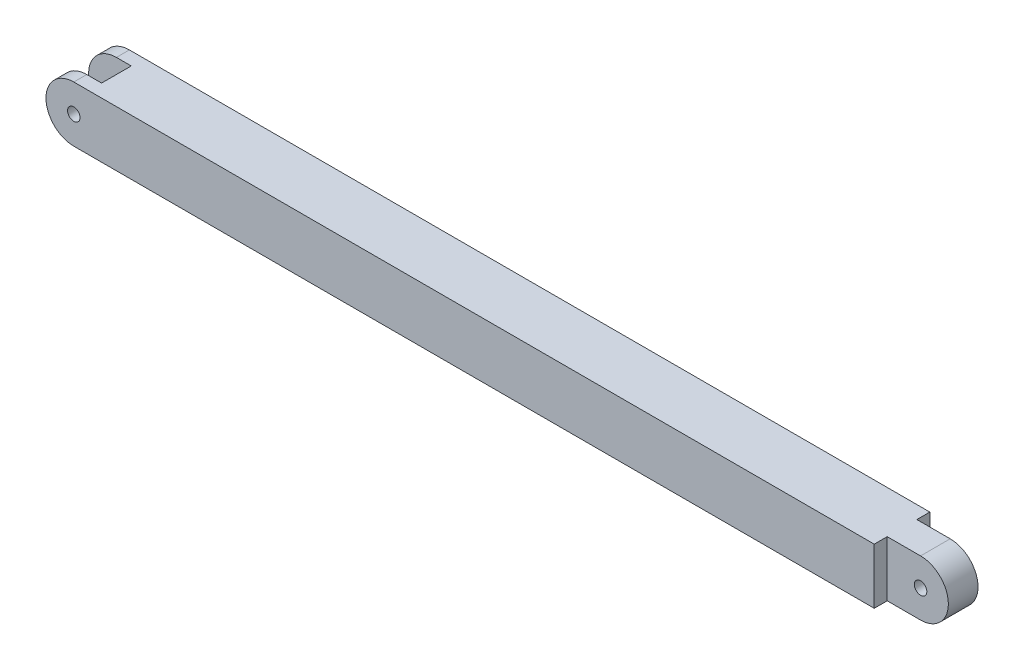
ISO-10303-21;
HEADER;
FILE_DESCRIPTION(('STEP AP214'),'2;1');
FILE_NAME('part.step','',(''),(''),'','','');
FILE_SCHEMA(('AUTOMOTIVE_DESIGN { 1 0 10303 214 1 1 1 1 }'));
ENDSEC;
DATA;
#1=APPLICATION_CONTEXT('core data for automotive mechanical design processes');
#2=APPLICATION_PROTOCOL_DEFINITION('international standard','automotive_design',2000,#1);
#3=PRODUCT_CONTEXT('',#1,'mechanical');
#4=PRODUCT('Part','Part','',(#3));
#5=PRODUCT_RELATED_PRODUCT_CATEGORY('part','',(#4));
#6=PRODUCT_DEFINITION_FORMATION('','',#4);
#7=PRODUCT_DEFINITION_CONTEXT('part definition',#1,'design');
#8=PRODUCT_DEFINITION('design','',#6,#7);
#9=PRODUCT_DEFINITION_SHAPE('','',#8);
#10=(LENGTH_UNIT() NAMED_UNIT(*) SI_UNIT(.MILLI.,.METRE.));
#11=(NAMED_UNIT(*) PLANE_ANGLE_UNIT() SI_UNIT($,.RADIAN.));
#12=(NAMED_UNIT(*) SI_UNIT($,.STERADIAN.) SOLID_ANGLE_UNIT());
#13=UNCERTAINTY_MEASURE_WITH_UNIT(LENGTH_MEASURE(1.E-05),#10,'distance_accuracy_value','');
#14=(GEOMETRIC_REPRESENTATION_CONTEXT(3) GLOBAL_UNCERTAINTY_ASSIGNED_CONTEXT((#13)) GLOBAL_UNIT_ASSIGNED_CONTEXT((#10,
#11,#12)) REPRESENTATION_CONTEXT('',''));
#15=CARTESIAN_POINT('',(0.,0.,0.));
#16=DIRECTION('',(0.,0.,1.));
#17=DIRECTION('',(1.,0.,0.));
#18=AXIS2_PLACEMENT_3D('',#15,#16,#17);
#19=CARTESIAN_POINT('',(-225.,0.,15.));
#20=DIRECTION('',(0.,0.,-1.));
#21=DIRECTION('',(-1.,0.,0.));
#22=AXIS2_PLACEMENT_3D('',#19,#20,#21);
#23=CYLINDRICAL_SURFACE('',#22,15.);
#24=DIRECTION('',(0.,0.,-1.));
#25=VECTOR('',#24,1.);
#26=CARTESIAN_POINT('',(-225.,-15.,15.));
#27=LINE('',#26,#25);
#28=CARTESIAN_POINT('',(-225.,-15.0000000000001,-8.));
#29=VERTEX_POINT('',#28);
#30=CARTESIAN_POINT('',(-225.,-15.,-15.));
#31=VERTEX_POINT('',#30);
#32=EDGE_CURVE('E223',#29,#31,#27,.T.);
#33=ORIENTED_EDGE('',*,*,#32,.F.);
#34=CARTESIAN_POINT('',(-225.,0.,-8.));
#35=DIRECTION('',(0.,0.,-1.));
#36=DIRECTION('',(-1.,0.,0.));
#37=AXIS2_PLACEMENT_3D('',#34,#35,#36);
#38=CIRCLE('',#37,15.);
#39=CARTESIAN_POINT('',(-225.,15.,-8.));
#40=VERTEX_POINT('',#39);
#41=EDGE_CURVE('E179',#29,#40,#38,.T.);
#42=ORIENTED_EDGE('',*,*,#41,.T.);
#43=DIRECTION('',(0.,0.,-1.));
#44=VECTOR('',#43,1.);
#45=CARTESIAN_POINT('',(-225.,15.,15.));
#46=LINE('',#45,#44);
#47=CARTESIAN_POINT('',(-225.,15.,-15.));
#48=VERTEX_POINT('',#47);
#49=EDGE_CURVE('E206',#40,#48,#46,.T.);
#50=ORIENTED_EDGE('',*,*,#49,.T.);
#51=CARTESIAN_POINT('',(-225.,0.,-15.));
#52=DIRECTION('',(0.,0.,1.));
#53=DIRECTION('',(1.,0.,0.));
#54=AXIS2_PLACEMENT_3D('',#51,#52,#53);
#55=CIRCLE('',#54,15.);
#56=EDGE_CURVE('E196',#48,#31,#55,.T.);
#57=ORIENTED_EDGE('',*,*,#56,.T.);
#58=EDGE_LOOP('',(#33,#42,#50,#57));
#59=FACE_BOUND('',#58,.T.);
#60=ADVANCED_FACE('F33',(#59),#23,.T.);
#61=CARTESIAN_POINT('',(-225.,0.,15.));
#62=DIRECTION('',(0.,0.,1.));
#63=DIRECTION('',(1.,0.,0.));
#64=AXIS2_PLACEMENT_3D('',#61,#62,#63);
#65=CYLINDRICAL_SURFACE('',#64,3.3782);
#66=CARTESIAN_POINT('',(-225.,0.,-8.));
#67=DIRECTION('',(0.,0.,-1.));
#68=DIRECTION('',(-1.,0.,0.));
#69=AXIS2_PLACEMENT_3D('',#66,#67,#68);
#70=CIRCLE('',#69,3.3782);
#71=CARTESIAN_POINT('',(-228.3782,0.,-8.));
#72=VERTEX_POINT('',#71);
#73=EDGE_CURVE('E178',#72,#72,#70,.F.);
#74=ORIENTED_EDGE('',*,*,#73,.T.);
#75=EDGE_LOOP('',(#74));
#76=FACE_BOUND('',#75,.T.);
#77=CARTESIAN_POINT('',(-225.,0.,-15.));
#78=DIRECTION('',(0.,0.,1.));
#79=DIRECTION('',(1.,0.,0.));
#80=AXIS2_PLACEMENT_3D('',#77,#78,#79);
#81=CIRCLE('',#80,3.3782);
#82=CARTESIAN_POINT('',(-221.6218,0.,-15.));
#83=VERTEX_POINT('',#82);
#84=EDGE_CURVE('E193',#83,#83,#81,.T.);
#85=ORIENTED_EDGE('',*,*,#84,.F.);
#86=EDGE_LOOP('',(#85));
#87=FACE_BOUND('',#86,.T.);
#88=ADVANCED_FACE('F277',(#76,#87),#65,.F.);
#89=CARTESIAN_POINT('',(-225.,15.,15.));
#90=VERTEX_POINT('',#89);
#91=CARTESIAN_POINT('',(-225.,15.,8.));
#92=VERTEX_POINT('',#91);
#93=EDGE_CURVE('E214',#90,#92,#46,.T.);
#94=ORIENTED_EDGE('',*,*,#93,.T.);
#95=CARTESIAN_POINT('',(-225.,0.,8.));
#96=DIRECTION('',(0.,0.,1.));
#97=DIRECTION('',(1.,0.,0.));
#98=AXIS2_PLACEMENT_3D('',#95,#96,#97);
#99=CIRCLE('',#98,15.);
#100=CARTESIAN_POINT('',(-225.,-15.0000000000001,8.));
#101=VERTEX_POINT('',#100);
#102=EDGE_CURVE('E48',#92,#101,#99,.T.);
#103=ORIENTED_EDGE('',*,*,#102,.T.);
#104=CARTESIAN_POINT('',(-225.,-15.,15.));
#105=VERTEX_POINT('',#104);
#106=EDGE_CURVE('E142',#105,#101,#27,.T.);
#107=ORIENTED_EDGE('',*,*,#106,.F.);
#108=CARTESIAN_POINT('',(-225.,0.,15.));
#109=DIRECTION('',(0.,0.,1.));
#110=DIRECTION('',(1.,0.,0.));
#111=AXIS2_PLACEMENT_3D('',#108,#109,#110);
#112=CIRCLE('',#111,15.);
#113=EDGE_CURVE('E197',#90,#105,#112,.T.);
#114=ORIENTED_EDGE('',*,*,#113,.F.);
#115=EDGE_LOOP('',(#94,#103,#107,#114));
#116=FACE_BOUND('',#115,.T.);
#117=ADVANCED_FACE('F35',(#116),#23,.T.);
#118=CARTESIAN_POINT('',(-225.,-15.,15.));
#119=DIRECTION('',(0.,1.,0.));
#120=DIRECTION('',(-1.,0.,0.));
#121=AXIS2_PLACEMENT_3D('',#118,#119,#120);
#122=PLANE('',#121);
#123=DIRECTION('',(0.,0.,-1.));
#124=VECTOR('',#123,1.);
#125=CARTESIAN_POINT('',(-217.,-15.0000000000001,-8.));
#126=LINE('',#125,#124);
#127=CARTESIAN_POINT('',(-217.,-15.0000000000001,8.));
#128=VERTEX_POINT('',#127);
#129=CARTESIAN_POINT('',(-217.,-15.0000000000001,-8.));
#130=VERTEX_POINT('',#129);
#131=EDGE_CURVE('E133',#128,#130,#126,.T.);
#132=ORIENTED_EDGE('',*,*,#131,.T.);
#133=DIRECTION('',(-1.,0.,0.));
#134=VECTOR('',#133,1.);
#135=CARTESIAN_POINT('',(-257.,-15.0000000000001,-8.));
#136=LINE('',#135,#134);
#137=EDGE_CURVE('E130',#130,#29,#136,.T.);
#138=ORIENTED_EDGE('',*,*,#137,.T.);
#139=ORIENTED_EDGE('',*,*,#32,.T.);
#140=DIRECTION('',(1.,0.,0.));
#141=VECTOR('',#140,1.);
#142=CARTESIAN_POINT('',(-225.,-15.,-15.));
#143=LINE('',#142,#141);
#144=CARTESIAN_POINT('',(207.,-14.9999999999999,-15.));
#145=VERTEX_POINT('',#144);
#146=EDGE_CURVE('E209',#31,#145,#143,.T.);
#147=ORIENTED_EDGE('',*,*,#146,.T.);
#148=DIRECTION('',(0.,0.,1.));
#149=VECTOR('',#148,1.);
#150=CARTESIAN_POINT('',(207.,-15.,-28.9161112376698));
#151=LINE('',#150,#149);
#152=CARTESIAN_POINT('',(207.,-15.,-8.));
#153=VERTEX_POINT('',#152);
#154=EDGE_CURVE('E154',#145,#153,#151,.T.);
#155=ORIENTED_EDGE('',*,*,#154,.T.);
#156=DIRECTION('',(1.,0.,0.));
#157=VECTOR('',#156,1.);
#158=CARTESIAN_POINT('',(207.,-15.,-8.));
#159=LINE('',#158,#157);
#160=CARTESIAN_POINT('',(225.,-15.,-8.));
#161=VERTEX_POINT('',#160);
#162=EDGE_CURVE('E157',#153,#161,#159,.T.);
#163=ORIENTED_EDGE('',*,*,#162,.T.);
#164=DIRECTION('',(0.,0.,-1.));
#165=VECTOR('',#164,1.);
#166=CARTESIAN_POINT('',(225.,-14.9999999999999,15.));
#167=LINE('',#166,#165);
#168=CARTESIAN_POINT('',(225.,-15.,8.));
#169=VERTEX_POINT('',#168);
#170=EDGE_CURVE('E220',#169,#161,#167,.T.);
#171=ORIENTED_EDGE('',*,*,#170,.F.);
#172=DIRECTION('',(-1.,0.,0.));
#173=VECTOR('',#172,1.);
#174=CARTESIAN_POINT('',(207.,-15.,8.));
#175=LINE('',#174,#173);
#176=CARTESIAN_POINT('',(207.,-15.,8.));
#177=VERTEX_POINT('',#176);
#178=EDGE_CURVE('E170',#169,#177,#175,.T.);
#179=ORIENTED_EDGE('',*,*,#178,.T.);
#180=DIRECTION('',(0.,0.,1.));
#181=VECTOR('',#180,1.);
#182=CARTESIAN_POINT('',(207.,-15.,28.9161112376696));
#183=LINE('',#182,#181);
#184=CARTESIAN_POINT('',(207.,-15.,15.));
#185=VERTEX_POINT('',#184);
#186=EDGE_CURVE('E167',#177,#185,#183,.T.);
#187=ORIENTED_EDGE('',*,*,#186,.T.);
#188=DIRECTION('',(1.,0.,0.));
#189=VECTOR('',#188,1.);
#190=CARTESIAN_POINT('',(-225.,-15.,15.));
#191=LINE('',#190,#189);
#192=EDGE_CURVE('E200',#105,#185,#191,.T.);
#193=ORIENTED_EDGE('',*,*,#192,.F.);
#194=ORIENTED_EDGE('',*,*,#106,.T.);
#195=DIRECTION('',(1.,0.,0.));
#196=VECTOR('',#195,1.);
#197=CARTESIAN_POINT('',(-257.,-15.0000000000001,8.));
#198=LINE('',#197,#196);
#199=EDGE_CURVE('E124',#101,#128,#198,.T.);
#200=ORIENTED_EDGE('',*,*,#199,.T.);
#201=EDGE_LOOP('',(#132,#138,#139,#147,#155,#163,#171,#179,#187,#193,#194,#200));
#202=FACE_BOUND('',#201,.T.);
#203=ADVANCED_FACE('F140',(#202),#122,.F.);
#204=CARTESIAN_POINT('',(225.,0.,15.));
#205=DIRECTION('',(0.,0.,-1.));
#206=DIRECTION('',(-1.,0.,0.));
#207=AXIS2_PLACEMENT_3D('',#204,#205,#206);
#208=CYLINDRICAL_SURFACE('',#207,15.);
#209=ORIENTED_EDGE('',*,*,#170,.T.);
#210=CARTESIAN_POINT('',(225.,0.,-8.));
#211=DIRECTION('',(0.,0.,1.));
#212=DIRECTION('',(1.,0.,0.));
#213=AXIS2_PLACEMENT_3D('',#210,#211,#212);
#214=CIRCLE('',#213,15.);
#215=CARTESIAN_POINT('',(225.,15.0000000000001,-8.));
#216=VERTEX_POINT('',#215);
#217=EDGE_CURVE('E187',#161,#216,#214,.T.);
#218=ORIENTED_EDGE('',*,*,#217,.T.);
#219=DIRECTION('',(0.,0.,-1.));
#220=VECTOR('',#219,1.);
#221=CARTESIAN_POINT('',(225.,15.0000000000001,15.));
#222=LINE('',#221,#220);
#223=CARTESIAN_POINT('',(225.,15.0000000000001,8.));
#224=VERTEX_POINT('',#223);
#225=EDGE_CURVE('E217',#224,#216,#222,.T.);
#226=ORIENTED_EDGE('',*,*,#225,.F.);
#227=CARTESIAN_POINT('',(225.,0.,8.));
#228=DIRECTION('',(0.,0.,-1.));
#229=DIRECTION('',(-1.,0.,0.));
#230=AXIS2_PLACEMENT_3D('',#227,#228,#229);
#231=CIRCLE('',#230,15.);
#232=EDGE_CURVE('E183',#224,#169,#231,.T.);
#233=ORIENTED_EDGE('',*,*,#232,.T.);
#234=EDGE_LOOP('',(#209,#218,#226,#233));
#235=FACE_BOUND('',#234,.T.);
#236=ADVANCED_FACE('F253',(#235),#208,.T.);
#237=CARTESIAN_POINT('',(-225.,15.,15.));
#238=DIRECTION('',(0.,-1.,0.));
#239=DIRECTION('',(1.,0.,0.));
#240=AXIS2_PLACEMENT_3D('',#237,#238,#239);
#241=PLANE('',#240);
#242=ORIENTED_EDGE('',*,*,#49,.F.);
#243=DIRECTION('',(-1.,0.,0.));
#244=VECTOR('',#243,1.);
#245=CARTESIAN_POINT('',(-257.,15.,-8.));
#246=LINE('',#245,#244);
#247=CARTESIAN_POINT('',(-217.,15.,-8.));
#248=VERTEX_POINT('',#247);
#249=EDGE_CURVE('E143',#248,#40,#246,.T.);
#250=ORIENTED_EDGE('',*,*,#249,.F.);
#251=DIRECTION('',(0.,0.,-1.));
#252=VECTOR('',#251,1.);
#253=CARTESIAN_POINT('',(-217.,15.,-8.));
#254=LINE('',#253,#252);
#255=CARTESIAN_POINT('',(-217.,15.,8.));
#256=VERTEX_POINT('',#255);
#257=EDGE_CURVE('E145',#256,#248,#254,.T.);
#258=ORIENTED_EDGE('',*,*,#257,.F.);
#259=DIRECTION('',(1.,0.,0.));
#260=VECTOR('',#259,1.);
#261=CARTESIAN_POINT('',(-257.,15.,8.));
#262=LINE('',#261,#260);
#263=EDGE_CURVE('E125',#92,#256,#262,.T.);
#264=ORIENTED_EDGE('',*,*,#263,.F.);
#265=ORIENTED_EDGE('',*,*,#93,.F.);
#266=DIRECTION('',(-1.,0.,0.));
#267=VECTOR('',#266,1.);
#268=CARTESIAN_POINT('',(-225.,15.,15.));
#269=LINE('',#268,#267);
#270=CARTESIAN_POINT('',(207.,15.0000000000001,15.));
#271=VERTEX_POINT('',#270);
#272=EDGE_CURVE('E204',#271,#90,#269,.T.);
#273=ORIENTED_EDGE('',*,*,#272,.F.);
#274=DIRECTION('',(0.,0.,1.));
#275=VECTOR('',#274,1.);
#276=CARTESIAN_POINT('',(207.,15.0000000000001,28.9161112376696));
#277=LINE('',#276,#275);
#278=CARTESIAN_POINT('',(207.,15.0000000000001,8.));
#279=VERTEX_POINT('',#278);
#280=EDGE_CURVE('E55',#279,#271,#277,.T.);
#281=ORIENTED_EDGE('',*,*,#280,.F.);
#282=DIRECTION('',(-1.,0.,0.));
#283=VECTOR('',#282,1.);
#284=CARTESIAN_POINT('',(207.,15.0000000000001,8.));
#285=LINE('',#284,#283);
#286=EDGE_CURVE('E171',#224,#279,#285,.T.);
#287=ORIENTED_EDGE('',*,*,#286,.F.);
#288=ORIENTED_EDGE('',*,*,#225,.T.);
#289=DIRECTION('',(1.,0.,0.));
#290=VECTOR('',#289,1.);
#291=CARTESIAN_POINT('',(207.,15.0000000000001,-8.));
#292=LINE('',#291,#290);
#293=CARTESIAN_POINT('',(207.,15.0000000000001,-8.));
#294=VERTEX_POINT('',#293);
#295=EDGE_CURVE('E158',#294,#216,#292,.T.);
#296=ORIENTED_EDGE('',*,*,#295,.F.);
#297=DIRECTION('',(0.,0.,1.));
#298=VECTOR('',#297,1.);
#299=CARTESIAN_POINT('',(207.,15.0000000000001,-28.9161112376698));
#300=LINE('',#299,#298);
#301=CARTESIAN_POINT('',(207.,15.0000000000001,-15.));
#302=VERTEX_POINT('',#301);
#303=EDGE_CURVE('E161',#302,#294,#300,.T.);
#304=ORIENTED_EDGE('',*,*,#303,.F.);
#305=DIRECTION('',(-1.,0.,0.));
#306=VECTOR('',#305,1.);
#307=CARTESIAN_POINT('',(-225.,15.,-15.));
#308=LINE('',#307,#306);
#309=EDGE_CURVE('E201',#302,#48,#308,.T.);
#310=ORIENTED_EDGE('',*,*,#309,.T.);
#311=EDGE_LOOP('',(#242,#250,#258,#264,#265,#273,#281,#287,#288,#296,#304,#310));
#312=FACE_BOUND('',#311,.T.);
#313=ADVANCED_FACE('F245',(#312),#241,.F.);
#314=CARTESIAN_POINT('',(-225.,0.,15.));
#315=DIRECTION('',(0.,0.,1.));
#316=DIRECTION('',(1.,0.,0.));
#317=AXIS2_PLACEMENT_3D('',#314,#315,#316);
#318=PLANE('',#317);
#319=DIRECTION('',(0.,-1.,0.));
#320=VECTOR('',#319,1.);
#321=CARTESIAN_POINT('',(207.,0.,15.));
#322=LINE('',#321,#320);
#323=EDGE_CURVE('E11',#271,#185,#322,.T.);
#324=ORIENTED_EDGE('',*,*,#323,.F.);
#325=ORIENTED_EDGE('',*,*,#272,.T.);
#326=ORIENTED_EDGE('',*,*,#113,.T.);
#327=ORIENTED_EDGE('',*,*,#192,.T.);
#328=EDGE_LOOP('',(#324,#325,#326,#327));
#329=FACE_BOUND('',#328,.T.);
#330=CARTESIAN_POINT('',(-225.,0.,15.));
#331=DIRECTION('',(0.,0.,1.));
#332=DIRECTION('',(1.,0.,0.));
#333=AXIS2_PLACEMENT_3D('',#330,#331,#332);
#334=CIRCLE('',#333,3.3782);
#335=CARTESIAN_POINT('',(-221.6218,0.,15.));
#336=VERTEX_POINT('',#335);
#337=EDGE_CURVE('E190',#336,#336,#334,.T.);
#338=ORIENTED_EDGE('',*,*,#337,.F.);
#339=EDGE_LOOP('',(#338));
#340=FACE_BOUND('',#339,.T.);
#341=ADVANCED_FACE('F262',(#329,#340),#318,.T.);
#342=CARTESIAN_POINT('',(-225.,0.,-15.));
#343=DIRECTION('',(0.,0.,1.));
#344=DIRECTION('',(1.,0.,0.));
#345=AXIS2_PLACEMENT_3D('',#342,#343,#344);
#346=PLANE('',#345);
#347=ORIENTED_EDGE('',*,*,#84,.T.);
#348=EDGE_LOOP('',(#347));
#349=FACE_BOUND('',#348,.T.);
#350=ORIENTED_EDGE('',*,*,#309,.F.);
#351=DIRECTION('',(0.,-1.,0.));
#352=VECTOR('',#351,1.);
#353=CARTESIAN_POINT('',(207.,0.,-15.));
#354=LINE('',#353,#352);
#355=EDGE_CURVE('E41',#302,#145,#354,.T.);
#356=ORIENTED_EDGE('',*,*,#355,.T.);
#357=ORIENTED_EDGE('',*,*,#146,.F.);
#358=ORIENTED_EDGE('',*,*,#56,.F.);
#359=EDGE_LOOP('',(#350,#356,#357,#358));
#360=FACE_BOUND('',#359,.T.);
#361=ADVANCED_FACE('F236',(#349,#360),#346,.F.);
#362=CARTESIAN_POINT('',(-225.,0.,8.));
#363=DIRECTION('',(0.,0.,1.));
#364=DIRECTION('',(1.,0.,0.));
#365=AXIS2_PLACEMENT_3D('',#362,#363,#364);
#366=CIRCLE('',#365,3.3782);
#367=CARTESIAN_POINT('',(-221.6218,0.,8.));
#368=VERTEX_POINT('',#367);
#369=EDGE_CURVE('E152',#368,#368,#366,.F.);
#370=ORIENTED_EDGE('',*,*,#369,.T.);
#371=EDGE_LOOP('',(#370));
#372=FACE_BOUND('',#371,.T.);
#373=ORIENTED_EDGE('',*,*,#337,.T.);
#374=EDGE_LOOP('',(#373));
#375=FACE_BOUND('',#374,.T.);
#376=ADVANCED_FACE('F282',(#372,#375),#65,.F.);
#377=CARTESIAN_POINT('',(-257.,-15.0000000000001,-8.));
#378=DIRECTION('',(0.,0.,-1.));
#379=DIRECTION('',(-1.,0.,0.));
#380=AXIS2_PLACEMENT_3D('',#377,#378,#379);
#381=PLANE('',#380);
#382=ORIENTED_EDGE('',*,*,#73,.F.);
#383=EDGE_LOOP('',(#382));
#384=FACE_BOUND('',#383,.T.);
#385=ORIENTED_EDGE('',*,*,#137,.F.);
#386=DIRECTION('',(0.,1.,0.));
#387=VECTOR('',#386,1.);
#388=CARTESIAN_POINT('',(-217.,-15.0000000000001,-8.));
#389=LINE('',#388,#387);
#390=EDGE_CURVE('E129',#130,#248,#389,.T.);
#391=ORIENTED_EDGE('',*,*,#390,.T.);
#392=ORIENTED_EDGE('',*,*,#249,.T.);
#393=ORIENTED_EDGE('',*,*,#41,.F.);
#394=EDGE_LOOP('',(#385,#391,#392,#393));
#395=FACE_BOUND('',#394,.T.);
#396=ADVANCED_FACE('F304',(#384,#395),#381,.F.);
#397=CARTESIAN_POINT('',(-257.,-15.0000000000001,8.));
#398=DIRECTION('',(0.,0.,1.));
#399=DIRECTION('',(1.,0.,0.));
#400=AXIS2_PLACEMENT_3D('',#397,#398,#399);
#401=PLANE('',#400);
#402=ORIENTED_EDGE('',*,*,#369,.F.);
#403=EDGE_LOOP('',(#402));
#404=FACE_BOUND('',#403,.T.);
#405=ORIENTED_EDGE('',*,*,#263,.T.);
#406=DIRECTION('',(0.,1.,0.));
#407=VECTOR('',#406,1.);
#408=CARTESIAN_POINT('',(-217.,-15.0000000000001,8.));
#409=LINE('',#408,#407);
#410=EDGE_CURVE('E120',#128,#256,#409,.T.);
#411=ORIENTED_EDGE('',*,*,#410,.F.);
#412=ORIENTED_EDGE('',*,*,#199,.F.);
#413=ORIENTED_EDGE('',*,*,#102,.F.);
#414=EDGE_LOOP('',(#405,#411,#412,#413));
#415=FACE_BOUND('',#414,.T.);
#416=ADVANCED_FACE('F122',(#404,#415),#401,.F.);
#417=CARTESIAN_POINT('',(-217.,-15.0000000000001,-8.));
#418=DIRECTION('',(1.,0.,0.));
#419=DIRECTION('',(0.,1.,0.));
#420=AXIS2_PLACEMENT_3D('',#417,#418,#419);
#421=PLANE('',#420);
#422=ORIENTED_EDGE('',*,*,#257,.T.);
#423=ORIENTED_EDGE('',*,*,#390,.F.);
#424=ORIENTED_EDGE('',*,*,#131,.F.);
#425=ORIENTED_EDGE('',*,*,#410,.T.);
#426=EDGE_LOOP('',(#422,#423,#424,#425));
#427=FACE_BOUND('',#426,.T.);
#428=ADVANCED_FACE('F134',(#427),#421,.F.);
#429=CARTESIAN_POINT('',(207.,-15.,8.));
#430=DIRECTION('',(0.,0.,-1.));
#431=DIRECTION('',(-1.,0.,0.));
#432=AXIS2_PLACEMENT_3D('',#429,#430,#431);
#433=PLANE('',#432);
#434=CARTESIAN_POINT('',(225.,0.,8.));
#435=DIRECTION('',(0.,0.,-1.));
#436=DIRECTION('',(-1.,0.,0.));
#437=AXIS2_PLACEMENT_3D('',#434,#435,#436);
#438=CIRCLE('',#437,3.3782);
#439=CARTESIAN_POINT('',(221.6218,0.,8.));
#440=VERTEX_POINT('',#439);
#441=EDGE_CURVE('E182',#440,#440,#438,.F.);
#442=ORIENTED_EDGE('',*,*,#441,.F.);
#443=EDGE_LOOP('',(#442));
#444=FACE_BOUND('',#443,.T.);
#445=ORIENTED_EDGE('',*,*,#286,.T.);
#446=DIRECTION('',(0.,1.,0.));
#447=VECTOR('',#446,1.);
#448=CARTESIAN_POINT('',(207.,-15.,8.));
#449=LINE('',#448,#447);
#450=EDGE_CURVE('E163',#177,#279,#449,.T.);
#451=ORIENTED_EDGE('',*,*,#450,.F.);
#452=ORIENTED_EDGE('',*,*,#178,.F.);
#453=ORIENTED_EDGE('',*,*,#232,.F.);
#454=EDGE_LOOP('',(#445,#451,#452,#453));
#455=FACE_BOUND('',#454,.T.);
#456=ADVANCED_FACE('F257',(#444,#455),#433,.F.);
#457=CARTESIAN_POINT('',(207.,-15.,28.9161112376696));
#458=DIRECTION('',(-1.,0.,0.));
#459=DIRECTION('',(0.,-1.,0.));
#460=AXIS2_PLACEMENT_3D('',#457,#458,#459);
#461=PLANE('',#460);
#462=ORIENTED_EDGE('',*,*,#323,.T.);
#463=ORIENTED_EDGE('',*,*,#186,.F.);
#464=ORIENTED_EDGE('',*,*,#450,.T.);
#465=ORIENTED_EDGE('',*,*,#280,.T.);
#466=EDGE_LOOP('',(#462,#463,#464,#465));
#467=FACE_BOUND('',#466,.T.);
#468=ADVANCED_FACE('F265',(#467),#461,.F.);
#469=CARTESIAN_POINT('',(207.,-15.,-28.9161112376698));
#470=DIRECTION('',(-1.,0.,0.));
#471=DIRECTION('',(0.,-1.,0.));
#472=AXIS2_PLACEMENT_3D('',#469,#470,#471);
#473=PLANE('',#472);
#474=ORIENTED_EDGE('',*,*,#303,.T.);
#475=DIRECTION('',(0.,1.,0.));
#476=VECTOR('',#475,1.);
#477=CARTESIAN_POINT('',(207.,-15.,-8.));
#478=LINE('',#477,#476);
#479=EDGE_CURVE('E150',#153,#294,#478,.T.);
#480=ORIENTED_EDGE('',*,*,#479,.F.);
#481=ORIENTED_EDGE('',*,*,#154,.F.);
#482=ORIENTED_EDGE('',*,*,#355,.F.);
#483=EDGE_LOOP('',(#474,#480,#481,#482));
#484=FACE_BOUND('',#483,.T.);
#485=ADVANCED_FACE('F247',(#484),#473,.F.);
#486=CARTESIAN_POINT('',(207.,-15.,-8.));
#487=DIRECTION('',(0.,0.,1.));
#488=DIRECTION('',(1.,0.,0.));
#489=AXIS2_PLACEMENT_3D('',#486,#487,#488);
#490=PLANE('',#489);
#491=CARTESIAN_POINT('',(225.,0.,-8.));
#492=DIRECTION('',(0.,0.,1.));
#493=DIRECTION('',(1.,0.,0.));
#494=AXIS2_PLACEMENT_3D('',#491,#492,#493);
#495=CIRCLE('',#494,3.3782);
#496=CARTESIAN_POINT('',(228.3782,0.,-8.));
#497=VERTEX_POINT('',#496);
#498=EDGE_CURVE('E186',#497,#497,#495,.F.);
#499=ORIENTED_EDGE('',*,*,#498,.F.);
#500=EDGE_LOOP('',(#499));
#501=FACE_BOUND('',#500,.T.);
#502=ORIENTED_EDGE('',*,*,#162,.F.);
#503=ORIENTED_EDGE('',*,*,#479,.T.);
#504=ORIENTED_EDGE('',*,*,#295,.T.);
#505=ORIENTED_EDGE('',*,*,#217,.F.);
#506=EDGE_LOOP('',(#502,#503,#504,#505));
#507=FACE_BOUND('',#506,.T.);
#508=ADVANCED_FACE('F250',(#501,#507),#490,.F.);
#509=CARTESIAN_POINT('',(225.,0.,15.));
#510=DIRECTION('',(0.,0.,1.));
#511=DIRECTION('',(1.,0.,0.));
#512=AXIS2_PLACEMENT_3D('',#509,#510,#511);
#513=CYLINDRICAL_SURFACE('',#512,3.3782);
#514=ORIENTED_EDGE('',*,*,#498,.T.);
#515=EDGE_LOOP('',(#514));
#516=FACE_BOUND('',#515,.T.);
#517=ORIENTED_EDGE('',*,*,#441,.T.);
#518=EDGE_LOOP('',(#517));
#519=FACE_BOUND('',#518,.T.);
#520=ADVANCED_FACE('F300',(#516,#519),#513,.F.);
#521=CLOSED_SHELL('',(#60,#88,#117,#203,#236,#313,#341,#361,#376,#396,#416,#428,#456,#468,#485,
#508,#520));
#522=MANIFOLD_SOLID_BREP('B2',#521);
#523=ADVANCED_BREP_SHAPE_REPRESENTATION('',(#18,#522),#14);
#524=SHAPE_DEFINITION_REPRESENTATION(#9,#523);
ENDSEC;
END-ISO-10303-21;
